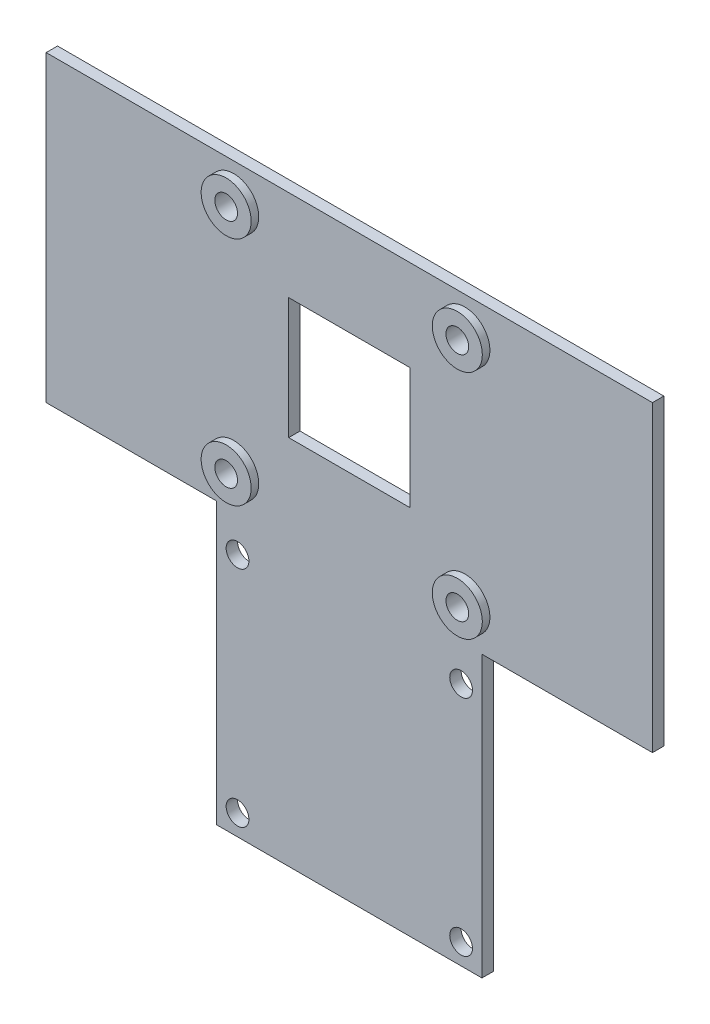
ISO-10303-21;
HEADER;
FILE_DESCRIPTION(('STEP AP214'),'2;1');
FILE_NAME('part.step','',(''),(''),'','','');
FILE_SCHEMA(('AUTOMOTIVE_DESIGN { 1 0 10303 214 1 1 1 1 }'));
ENDSEC;
DATA;
#1=APPLICATION_CONTEXT('core data for automotive mechanical design processes');
#2=APPLICATION_PROTOCOL_DEFINITION('international standard','automotive_design',2000,#1);
#3=PRODUCT_CONTEXT('',#1,'mechanical');
#4=PRODUCT('Part','Part','',(#3));
#5=PRODUCT_RELATED_PRODUCT_CATEGORY('part','',(#4));
#6=PRODUCT_DEFINITION_FORMATION('','',#4);
#7=PRODUCT_DEFINITION_CONTEXT('part definition',#1,'design');
#8=PRODUCT_DEFINITION('design','',#6,#7);
#9=PRODUCT_DEFINITION_SHAPE('','',#8);
#10=(LENGTH_UNIT() NAMED_UNIT(*) SI_UNIT(.MILLI.,.METRE.));
#11=(NAMED_UNIT(*) PLANE_ANGLE_UNIT() SI_UNIT($,.RADIAN.));
#12=(NAMED_UNIT(*) SI_UNIT($,.STERADIAN.) SOLID_ANGLE_UNIT());
#13=UNCERTAINTY_MEASURE_WITH_UNIT(LENGTH_MEASURE(1.E-05),#10,'distance_accuracy_value','');
#14=(GEOMETRIC_REPRESENTATION_CONTEXT(3) GLOBAL_UNCERTAINTY_ASSIGNED_CONTEXT((#13)) GLOBAL_UNIT_ASSIGNED_CONTEXT((#10,
#11,#12)) REPRESENTATION_CONTEXT('',''));
#15=CARTESIAN_POINT('',(0.,0.,0.));
#16=DIRECTION('',(0.,0.,1.));
#17=DIRECTION('',(1.,0.,0.));
#18=AXIS2_PLACEMENT_3D('',#15,#16,#17);
#19=CARTESIAN_POINT('',(0.,0.,1.5));
#20=DIRECTION('',(0.,0.,1.));
#21=DIRECTION('',(1.,0.,0.));
#22=AXIS2_PLACEMENT_3D('',#19,#20,#21);
#23=PLANE('',#22);
#24=CARTESIAN_POINT('',(-22.4791463831349,-14.9932103921682,1.5));
#25=DIRECTION('',(0.,0.,1.));
#26=DIRECTION('',(1.,0.,0.));
#27=AXIS2_PLACEMENT_3D('',#24,#25,#26);
#28=CIRCLE('',#27,3.3);
#29=CARTESIAN_POINT('',(-19.1791463831349,-14.9932103921682,1.5));
#30=VERTEX_POINT('',#29);
#31=EDGE_CURVE('E393',#30,#30,#28,.T.);
#32=ORIENTED_EDGE('',*,*,#31,.F.);
#33=EDGE_LOOP('',(#32));
#34=FACE_BOUND('',#33,.T.);
#35=CARTESIAN_POINT('',(-22.4791463831349,15.5067896078318,1.5));
#36=DIRECTION('',(0.,0.,1.));
#37=DIRECTION('',(1.,0.,0.));
#38=AXIS2_PLACEMENT_3D('',#35,#36,#37);
#39=CIRCLE('',#38,3.3);
#40=CARTESIAN_POINT('',(-19.1791463831349,15.5067896078318,1.5));
#41=VERTEX_POINT('',#40);
#42=EDGE_CURVE('E312',#41,#41,#39,.T.);
#43=ORIENTED_EDGE('',*,*,#42,.F.);
#44=EDGE_LOOP('',(#43));
#45=FACE_BOUND('',#44,.T.);
#46=CARTESIAN_POINT('',(-21.9791463831349,-53.9932103921682,1.5));
#47=DIRECTION('',(0.,0.,1.));
#48=DIRECTION('',(-1.,0.,0.));
#49=AXIS2_PLACEMENT_3D('',#46,#47,#48);
#50=CIRCLE('',#49,1.5);
#51=CARTESIAN_POINT('',(-23.4791463831349,-53.9932103921682,1.5));
#52=VERTEX_POINT('',#51);
#53=EDGE_CURVE('E334',#52,#52,#50,.T.);
#54=ORIENTED_EDGE('',*,*,#53,.F.);
#55=EDGE_LOOP('',(#54));
#56=FACE_BOUND('',#55,.T.);
#57=CARTESIAN_POINT('',(-21.9791463831349,-24.4932103921682,1.5));
#58=DIRECTION('',(0.,0.,1.));
#59=DIRECTION('',(-1.,0.,0.));
#60=AXIS2_PLACEMENT_3D('',#57,#58,#59);
#61=CIRCLE('',#60,1.5);
#62=CARTESIAN_POINT('',(-23.4791463831349,-24.4932103921682,1.5));
#63=VERTEX_POINT('',#62);
#64=EDGE_CURVE('E157',#63,#63,#61,.T.);
#65=ORIENTED_EDGE('',*,*,#64,.F.);
#66=EDGE_LOOP('',(#65));
#67=FACE_BOUND('',#66,.T.);
#68=DIRECTION('',(0.,-1.,0.));
#69=VECTOR('',#68,1.);
#70=CARTESIAN_POINT('',(-47.2291463831347,20.2567896078318,1.5));
#71=LINE('',#70,#69);
#72=CARTESIAN_POINT('',(-47.2291463831347,20.2567896078318,1.5));
#73=VERTEX_POINT('',#72);
#74=CARTESIAN_POINT('',(-47.2291463831347,-19.7432103921682,1.5));
#75=VERTEX_POINT('',#74);
#76=EDGE_CURVE('E179',#73,#75,#71,.T.);
#77=ORIENTED_EDGE('',*,*,#76,.T.);
#78=DIRECTION('',(1.,0.,0.));
#79=VECTOR('',#78,1.);
#80=CARTESIAN_POINT('',(-47.2291463831347,-19.7432103921682,1.5));
#81=LINE('',#80,#79);
#82=CARTESIAN_POINT('',(-24.7291463831349,-19.7432103921682,1.5));
#83=VERTEX_POINT('',#82);
#84=EDGE_CURVE('E182',#75,#83,#81,.T.);
#85=ORIENTED_EDGE('',*,*,#84,.T.);
#86=DIRECTION('',(0.,-1.,0.));
#87=VECTOR('',#86,1.);
#88=CARTESIAN_POINT('',(-24.7291463831349,-19.7432103921682,1.5));
#89=LINE('',#88,#87);
#90=CARTESIAN_POINT('',(-24.7291463831349,-56.7432103921682,1.5));
#91=VERTEX_POINT('',#90);
#92=EDGE_CURVE('E185',#83,#91,#89,.T.);
#93=ORIENTED_EDGE('',*,*,#92,.T.);
#94=DIRECTION('',(1.,0.,0.));
#95=VECTOR('',#94,1.);
#96=CARTESIAN_POINT('',(-24.7291463831349,-56.7432103921682,1.5));
#97=LINE('',#96,#95);
#98=CARTESIAN_POINT('',(10.2708536168651,-56.7432103921682,1.5));
#99=VERTEX_POINT('',#98);
#100=EDGE_CURVE('E187',#91,#99,#97,.T.);
#101=ORIENTED_EDGE('',*,*,#100,.T.);
#102=DIRECTION('',(0.,1.,0.));
#103=VECTOR('',#102,1.);
#104=CARTESIAN_POINT('',(10.2708536168651,-56.7432103921682,1.5));
#105=LINE('',#104,#103);
#106=CARTESIAN_POINT('',(10.2708536168651,-19.7432103921682,1.5));
#107=VERTEX_POINT('',#106);
#108=EDGE_CURVE('E189',#99,#107,#105,.T.);
#109=ORIENTED_EDGE('',*,*,#108,.T.);
#110=DIRECTION('',(1.,0.,0.));
#111=VECTOR('',#110,1.);
#112=CARTESIAN_POINT('',(10.2708536168651,-19.7432103921682,1.5));
#113=LINE('',#112,#111);
#114=CARTESIAN_POINT('',(32.7708536168649,-19.7432103921682,1.5));
#115=VERTEX_POINT('',#114);
#116=EDGE_CURVE('E191',#107,#115,#113,.T.);
#117=ORIENTED_EDGE('',*,*,#116,.T.);
#118=DIRECTION('',(0.,1.,0.));
#119=VECTOR('',#118,1.);
#120=CARTESIAN_POINT('',(32.7708536168649,20.2567896078318,1.5));
#121=LINE('',#120,#119);
#122=CARTESIAN_POINT('',(32.7708536168649,20.2567896078318,1.5));
#123=VERTEX_POINT('',#122);
#124=EDGE_CURVE('E193',#115,#123,#121,.T.);
#125=ORIENTED_EDGE('',*,*,#124,.T.);
#126=DIRECTION('',(-1.,0.,0.));
#127=VECTOR('',#126,1.);
#128=CARTESIAN_POINT('',(-47.2291463831347,20.2567896078318,1.5));
#129=LINE('',#128,#127);
#130=EDGE_CURVE('E195',#123,#73,#129,.T.);
#131=ORIENTED_EDGE('',*,*,#130,.T.);
#132=EDGE_LOOP('',(#77,#85,#93,#101,#109,#117,#125,#131));
#133=FACE_BOUND('',#132,.T.);
#134=DIRECTION('',(0.,1.,0.));
#135=VECTOR('',#134,1.);
#136=CARTESIAN_POINT('',(0.770853616865096,-7.74321039216817,1.5));
#137=LINE('',#136,#135);
#138=CARTESIAN_POINT('',(0.770853616865096,-7.74321039216817,1.5));
#139=VERTEX_POINT('',#138);
#140=CARTESIAN_POINT('',(0.770853616865096,8.25678960783183,1.5));
#141=VERTEX_POINT('',#140);
#142=EDGE_CURVE('E134',#139,#141,#137,.T.);
#143=ORIENTED_EDGE('',*,*,#142,.F.);
#144=DIRECTION('',(1.,0.,0.));
#145=VECTOR('',#144,1.);
#146=CARTESIAN_POINT('',(-15.2291463831349,-7.74321039216817,1.5));
#147=LINE('',#146,#145);
#148=CARTESIAN_POINT('',(-15.2291463831349,-7.74321039216817,1.5));
#149=VERTEX_POINT('',#148);
#150=EDGE_CURVE('E126',#149,#139,#147,.T.);
#151=ORIENTED_EDGE('',*,*,#150,.F.);
#152=DIRECTION('',(0.,-1.,0.));
#153=VECTOR('',#152,1.);
#154=CARTESIAN_POINT('',(-15.2291463831349,8.25678960783183,1.5));
#155=LINE('',#154,#153);
#156=CARTESIAN_POINT('',(-15.2291463831349,8.25678960783183,1.5));
#157=VERTEX_POINT('',#156);
#158=EDGE_CURVE('E150',#157,#149,#155,.T.);
#159=ORIENTED_EDGE('',*,*,#158,.F.);
#160=DIRECTION('',(-1.,0.,0.));
#161=VECTOR('',#160,1.);
#162=CARTESIAN_POINT('',(0.770853616865096,8.25678960783183,1.5));
#163=LINE('',#162,#161);
#164=EDGE_CURVE('E148',#141,#157,#163,.T.);
#165=ORIENTED_EDGE('',*,*,#164,.F.);
#166=EDGE_LOOP('',(#143,#151,#159,#165));
#167=FACE_BOUND('',#166,.T.);
#168=CARTESIAN_POINT('',(7.52085361686509,-24.4932103921682,1.5));
#169=DIRECTION('',(0.,0.,1.));
#170=DIRECTION('',(-1.,0.,0.));
#171=AXIS2_PLACEMENT_3D('',#168,#169,#170);
#172=CIRCLE('',#171,1.5);
#173=CARTESIAN_POINT('',(6.02085361686509,-24.4932103921682,1.5));
#174=VERTEX_POINT('',#173);
#175=EDGE_CURVE('E340',#174,#174,#172,.T.);
#176=ORIENTED_EDGE('',*,*,#175,.F.);
#177=EDGE_LOOP('',(#176));
#178=FACE_BOUND('',#177,.T.);
#179=CARTESIAN_POINT('',(7.52085361686509,-53.9932103921682,1.5));
#180=DIRECTION('',(0.,0.,1.));
#181=DIRECTION('',(-1.,0.,0.));
#182=AXIS2_PLACEMENT_3D('',#179,#180,#181);
#183=CIRCLE('',#182,1.5);
#184=CARTESIAN_POINT('',(6.02085361686509,-53.9932103921682,1.5));
#185=VERTEX_POINT('',#184);
#186=EDGE_CURVE('E328',#185,#185,#183,.T.);
#187=ORIENTED_EDGE('',*,*,#186,.F.);
#188=EDGE_LOOP('',(#187));
#189=FACE_BOUND('',#188,.T.);
#190=CARTESIAN_POINT('',(8.02085361686509,-14.9932103921682,1.5));
#191=DIRECTION('',(0.,0.,1.));
#192=DIRECTION('',(1.,0.,0.));
#193=AXIS2_PLACEMENT_3D('',#190,#191,#192);
#194=CIRCLE('',#193,3.3);
#195=CARTESIAN_POINT('',(11.3208536168651,-14.9932103921682,1.5));
#196=VERTEX_POINT('',#195);
#197=EDGE_CURVE('E390',#196,#196,#194,.T.);
#198=ORIENTED_EDGE('',*,*,#197,.F.);
#199=EDGE_LOOP('',(#198));
#200=FACE_BOUND('',#199,.T.);
#201=CARTESIAN_POINT('',(8.02085361686509,15.5067896078318,1.5));
#202=DIRECTION('',(0.,0.,1.));
#203=DIRECTION('',(1.,0.,0.));
#204=AXIS2_PLACEMENT_3D('',#201,#202,#203);
#205=CIRCLE('',#204,3.3);
#206=CARTESIAN_POINT('',(11.3208536168651,15.5067896078318,1.5));
#207=VERTEX_POINT('',#206);
#208=EDGE_CURVE('E319',#207,#207,#205,.T.);
#209=ORIENTED_EDGE('',*,*,#208,.F.);
#210=EDGE_LOOP('',(#209));
#211=FACE_BOUND('',#210,.T.);
#212=ADVANCED_FACE('F39',(#34,#45,#56,#67,#133,#167,#178,#189,#200,#211),#23,.T.);
#213=CARTESIAN_POINT('',(0.,0.,0.));
#214=DIRECTION('',(0.,0.,1.));
#215=DIRECTION('',(1.,0.,0.));
#216=AXIS2_PLACEMENT_3D('',#213,#214,#215);
#217=PLANE('',#216);
#218=CARTESIAN_POINT('',(-22.4791463831349,-14.9932103921682,0.));
#219=DIRECTION('',(0.,0.,1.));
#220=DIRECTION('',(-1.,0.,0.));
#221=AXIS2_PLACEMENT_3D('',#218,#219,#220);
#222=CIRCLE('',#221,1.5);
#223=CARTESIAN_POINT('',(-23.9791463831349,-14.9932103921682,0.));
#224=VERTEX_POINT('',#223);
#225=EDGE_CURVE('E143',#224,#224,#222,.T.);
#226=ORIENTED_EDGE('',*,*,#225,.T.);
#227=EDGE_LOOP('',(#226));
#228=FACE_BOUND('',#227,.T.);
#229=CARTESIAN_POINT('',(8.02085361686509,-14.9932103921682,0.));
#230=DIRECTION('',(0.,0.,1.));
#231=DIRECTION('',(1.,0.,0.));
#232=AXIS2_PLACEMENT_3D('',#229,#230,#231);
#233=CIRCLE('',#232,1.5);
#234=CARTESIAN_POINT('',(9.52085361686509,-14.9932103921682,0.));
#235=VERTEX_POINT('',#234);
#236=EDGE_CURVE('E169',#235,#235,#233,.T.);
#237=ORIENTED_EDGE('',*,*,#236,.T.);
#238=EDGE_LOOP('',(#237));
#239=FACE_BOUND('',#238,.T.);
#240=CARTESIAN_POINT('',(8.02085361686509,15.5067896078318,0.));
#241=DIRECTION('',(0.,0.,1.));
#242=DIRECTION('',(-1.,0.,0.));
#243=AXIS2_PLACEMENT_3D('',#240,#241,#242);
#244=CIRCLE('',#243,1.5);
#245=CARTESIAN_POINT('',(6.52085361686509,15.5067896078318,0.));
#246=VERTEX_POINT('',#245);
#247=EDGE_CURVE('E172',#246,#246,#244,.T.);
#248=ORIENTED_EDGE('',*,*,#247,.T.);
#249=EDGE_LOOP('',(#248));
#250=FACE_BOUND('',#249,.T.);
#251=CARTESIAN_POINT('',(-22.4791463831349,15.5067896078318,0.));
#252=DIRECTION('',(0.,0.,1.));
#253=DIRECTION('',(1.,0.,0.));
#254=AXIS2_PLACEMENT_3D('',#251,#252,#253);
#255=CIRCLE('',#254,1.5);
#256=CARTESIAN_POINT('',(-20.9791463831349,15.5067896078318,0.));
#257=VERTEX_POINT('',#256);
#258=EDGE_CURVE('E175',#257,#257,#255,.T.);
#259=ORIENTED_EDGE('',*,*,#258,.T.);
#260=EDGE_LOOP('',(#259));
#261=FACE_BOUND('',#260,.T.);
#262=DIRECTION('',(0.,-1.,0.));
#263=VECTOR('',#262,1.);
#264=CARTESIAN_POINT('',(-47.2291463831347,20.2567896078318,0.));
#265=LINE('',#264,#263);
#266=CARTESIAN_POINT('',(-47.2291463831347,20.2567896078318,0.));
#267=VERTEX_POINT('',#266);
#268=CARTESIAN_POINT('',(-47.2291463831347,-19.7432103921682,0.));
#269=VERTEX_POINT('',#268);
#270=EDGE_CURVE('E178',#267,#269,#265,.T.);
#271=ORIENTED_EDGE('',*,*,#270,.F.);
#272=DIRECTION('',(-1.,0.,0.));
#273=VECTOR('',#272,1.);
#274=CARTESIAN_POINT('',(-47.2291463831347,20.2567896078318,0.));
#275=LINE('',#274,#273);
#276=CARTESIAN_POINT('',(32.7708536168649,20.2567896078318,0.));
#277=VERTEX_POINT('',#276);
#278=EDGE_CURVE('E183',#277,#267,#275,.T.);
#279=ORIENTED_EDGE('',*,*,#278,.F.);
#280=DIRECTION('',(0.,1.,0.));
#281=VECTOR('',#280,1.);
#282=CARTESIAN_POINT('',(32.7708536168649,20.2567896078318,0.));
#283=LINE('',#282,#281);
#284=CARTESIAN_POINT('',(32.7708536168649,-19.7432103921682,0.));
#285=VERTEX_POINT('',#284);
#286=EDGE_CURVE('E210',#285,#277,#283,.T.);
#287=ORIENTED_EDGE('',*,*,#286,.F.);
#288=DIRECTION('',(1.,0.,0.));
#289=VECTOR('',#288,1.);
#290=CARTESIAN_POINT('',(10.2708536168651,-19.7432103921682,0.));
#291=LINE('',#290,#289);
#292=CARTESIAN_POINT('',(10.2708536168651,-19.7432103921682,0.));
#293=VERTEX_POINT('',#292);
#294=EDGE_CURVE('E208',#293,#285,#291,.T.);
#295=ORIENTED_EDGE('',*,*,#294,.F.);
#296=DIRECTION('',(0.,1.,0.));
#297=VECTOR('',#296,1.);
#298=CARTESIAN_POINT('',(10.2708536168651,-56.7432103921682,0.));
#299=LINE('',#298,#297);
#300=CARTESIAN_POINT('',(10.2708536168651,-56.7432103921682,0.));
#301=VERTEX_POINT('',#300);
#302=EDGE_CURVE('E206',#301,#293,#299,.T.);
#303=ORIENTED_EDGE('',*,*,#302,.F.);
#304=DIRECTION('',(1.,0.,0.));
#305=VECTOR('',#304,1.);
#306=CARTESIAN_POINT('',(-24.7291463831349,-56.7432103921682,0.));
#307=LINE('',#306,#305);
#308=CARTESIAN_POINT('',(-24.7291463831349,-56.7432103921682,0.));
#309=VERTEX_POINT('',#308);
#310=EDGE_CURVE('E204',#309,#301,#307,.T.);
#311=ORIENTED_EDGE('',*,*,#310,.F.);
#312=DIRECTION('',(0.,-1.,0.));
#313=VECTOR('',#312,1.);
#314=CARTESIAN_POINT('',(-24.7291463831349,-19.7432103921682,0.));
#315=LINE('',#314,#313);
#316=CARTESIAN_POINT('',(-24.7291463831349,-19.7432103921682,0.));
#317=VERTEX_POINT('',#316);
#318=EDGE_CURVE('E202',#317,#309,#315,.T.);
#319=ORIENTED_EDGE('',*,*,#318,.F.);
#320=DIRECTION('',(1.,0.,0.));
#321=VECTOR('',#320,1.);
#322=CARTESIAN_POINT('',(-47.2291463831347,-19.7432103921682,0.));
#323=LINE('',#322,#321);
#324=EDGE_CURVE('E200',#269,#317,#323,.T.);
#325=ORIENTED_EDGE('',*,*,#324,.F.);
#326=EDGE_LOOP('',(#271,#279,#287,#295,#303,#311,#319,#325));
#327=FACE_BOUND('',#326,.T.);
#328=DIRECTION('',(1.,0.,0.));
#329=VECTOR('',#328,1.);
#330=CARTESIAN_POINT('',(-7.2291463831349,-7.74321039216817,0.));
#331=LINE('',#330,#329);
#332=CARTESIAN_POINT('',(-15.2291463831349,-7.74321039216817,0.));
#333=VERTEX_POINT('',#332);
#334=CARTESIAN_POINT('',(0.770853616865096,-7.74321039216817,0.));
#335=VERTEX_POINT('',#334);
#336=EDGE_CURVE('E155',#333,#335,#331,.T.);
#337=ORIENTED_EDGE('',*,*,#336,.T.);
#338=DIRECTION('',(0.,1.,0.));
#339=VECTOR('',#338,1.);
#340=CARTESIAN_POINT('',(0.770853616865096,-7.74321039216817,0.));
#341=LINE('',#340,#339);
#342=CARTESIAN_POINT('',(0.770853616865096,8.25678960783183,0.));
#343=VERTEX_POINT('',#342);
#344=EDGE_CURVE('E141',#335,#343,#341,.T.);
#345=ORIENTED_EDGE('',*,*,#344,.T.);
#346=DIRECTION('',(-1.,0.,0.));
#347=VECTOR('',#346,1.);
#348=CARTESIAN_POINT('',(0.770853616865096,8.25678960783183,0.));
#349=LINE('',#348,#347);
#350=CARTESIAN_POINT('',(-15.2291463831349,8.25678960783183,0.));
#351=VERTEX_POINT('',#350);
#352=EDGE_CURVE('E159',#343,#351,#349,.T.);
#353=ORIENTED_EDGE('',*,*,#352,.T.);
#354=DIRECTION('',(0.,-1.,0.));
#355=VECTOR('',#354,1.);
#356=CARTESIAN_POINT('',(-15.2291463831349,8.25678960783183,0.));
#357=LINE('',#356,#355);
#358=EDGE_CURVE('E135',#351,#333,#357,.T.);
#359=ORIENTED_EDGE('',*,*,#358,.T.);
#360=EDGE_LOOP('',(#337,#345,#353,#359));
#361=FACE_BOUND('',#360,.T.);
#362=CARTESIAN_POINT('',(-21.9791463831349,-24.4932103921682,0.));
#363=DIRECTION('',(0.,0.,1.));
#364=DIRECTION('',(-1.,0.,0.));
#365=AXIS2_PLACEMENT_3D('',#362,#363,#364);
#366=CIRCLE('',#365,1.5);
#367=CARTESIAN_POINT('',(-23.4791463831349,-24.4932103921682,0.));
#368=VERTEX_POINT('',#367);
#369=EDGE_CURVE('E343',#368,#368,#366,.T.);
#370=ORIENTED_EDGE('',*,*,#369,.T.);
#371=EDGE_LOOP('',(#370));
#372=FACE_BOUND('',#371,.T.);
#373=CARTESIAN_POINT('',(7.52085361686509,-24.4932103921682,0.));
#374=DIRECTION('',(0.,0.,1.));
#375=DIRECTION('',(-1.,0.,0.));
#376=AXIS2_PLACEMENT_3D('',#373,#374,#375);
#377=CIRCLE('',#376,1.5);
#378=CARTESIAN_POINT('',(6.02085361686509,-24.4932103921682,0.));
#379=VERTEX_POINT('',#378);
#380=EDGE_CURVE('E337',#379,#379,#377,.T.);
#381=ORIENTED_EDGE('',*,*,#380,.T.);
#382=EDGE_LOOP('',(#381));
#383=FACE_BOUND('',#382,.T.);
#384=CARTESIAN_POINT('',(-21.9791463831349,-53.9932103921682,0.));
#385=DIRECTION('',(0.,0.,1.));
#386=DIRECTION('',(-1.,0.,0.));
#387=AXIS2_PLACEMENT_3D('',#384,#385,#386);
#388=CIRCLE('',#387,1.5);
#389=CARTESIAN_POINT('',(-23.4791463831349,-53.9932103921682,0.));
#390=VERTEX_POINT('',#389);
#391=EDGE_CURVE('E331',#390,#390,#388,.T.);
#392=ORIENTED_EDGE('',*,*,#391,.T.);
#393=EDGE_LOOP('',(#392));
#394=FACE_BOUND('',#393,.T.);
#395=CARTESIAN_POINT('',(7.52085361686509,-53.9932103921682,0.));
#396=DIRECTION('',(0.,0.,1.));
#397=DIRECTION('',(-1.,0.,0.));
#398=AXIS2_PLACEMENT_3D('',#395,#396,#397);
#399=CIRCLE('',#398,1.5);
#400=CARTESIAN_POINT('',(6.02085361686509,-53.9932103921682,0.));
#401=VERTEX_POINT('',#400);
#402=EDGE_CURVE('E326',#401,#401,#399,.T.);
#403=ORIENTED_EDGE('',*,*,#402,.T.);
#404=EDGE_LOOP('',(#403));
#405=FACE_BOUND('',#404,.T.);
#406=ADVANCED_FACE('F240',(#228,#239,#250,#261,#327,#361,#372,#383,#394,#405),#217,.F.);
#407=CARTESIAN_POINT('',(-47.2291463831347,20.2567896078318,1.5));
#408=DIRECTION('',(1.,0.,0.));
#409=DIRECTION('',(0.,1.,0.));
#410=AXIS2_PLACEMENT_3D('',#407,#408,#409);
#411=PLANE('',#410);
#412=ORIENTED_EDGE('',*,*,#270,.T.);
#413=DIRECTION('',(0.,0.,-1.));
#414=VECTOR('',#413,1.);
#415=CARTESIAN_POINT('',(-47.2291463831347,-19.7432103921682,1.5));
#416=LINE('',#415,#414);
#417=EDGE_CURVE('E11',#75,#269,#416,.T.);
#418=ORIENTED_EDGE('',*,*,#417,.F.);
#419=ORIENTED_EDGE('',*,*,#76,.F.);
#420=DIRECTION('',(0.,0.,-1.));
#421=VECTOR('',#420,1.);
#422=CARTESIAN_POINT('',(-47.2291463831347,20.2567896078318,1.5));
#423=LINE('',#422,#421);
#424=EDGE_CURVE('E197',#73,#267,#423,.T.);
#425=ORIENTED_EDGE('',*,*,#424,.T.);
#426=EDGE_LOOP('',(#412,#418,#419,#425));
#427=FACE_BOUND('',#426,.T.);
#428=ADVANCED_FACE('F41',(#427),#411,.F.);
#429=CARTESIAN_POINT('',(-47.2291463831347,-19.7432103921682,1.5));
#430=DIRECTION('',(0.,1.,0.));
#431=DIRECTION('',(0.,0.,1.));
#432=AXIS2_PLACEMENT_3D('',#429,#430,#431);
#433=PLANE('',#432);
#434=ORIENTED_EDGE('',*,*,#324,.T.);
#435=DIRECTION('',(0.,0.,-1.));
#436=VECTOR('',#435,1.);
#437=CARTESIAN_POINT('',(-24.7291463831349,-19.7432103921682,1.5));
#438=LINE('',#437,#436);
#439=EDGE_CURVE('E47',#83,#317,#438,.T.);
#440=ORIENTED_EDGE('',*,*,#439,.F.);
#441=ORIENTED_EDGE('',*,*,#84,.F.);
#442=ORIENTED_EDGE('',*,*,#417,.T.);
#443=EDGE_LOOP('',(#434,#440,#441,#442));
#444=FACE_BOUND('',#443,.T.);
#445=ADVANCED_FACE('F257',(#444),#433,.F.);
#446=CARTESIAN_POINT('',(-24.7291463831349,-19.7432103921682,1.5));
#447=DIRECTION('',(1.,0.,0.));
#448=DIRECTION('',(0.,1.,0.));
#449=AXIS2_PLACEMENT_3D('',#446,#447,#448);
#450=PLANE('',#449);
#451=ORIENTED_EDGE('',*,*,#318,.T.);
#452=DIRECTION('',(0.,0.,-1.));
#453=VECTOR('',#452,1.);
#454=CARTESIAN_POINT('',(-24.7291463831349,-56.7432103921682,1.5));
#455=LINE('',#454,#453);
#456=EDGE_CURVE('E227',#91,#309,#455,.T.);
#457=ORIENTED_EDGE('',*,*,#456,.F.);
#458=ORIENTED_EDGE('',*,*,#92,.F.);
#459=ORIENTED_EDGE('',*,*,#439,.T.);
#460=EDGE_LOOP('',(#451,#457,#458,#459));
#461=FACE_BOUND('',#460,.T.);
#462=ADVANCED_FACE('F234',(#461),#450,.F.);
#463=CARTESIAN_POINT('',(-24.7291463831349,-56.7432103921682,1.5));
#464=DIRECTION('',(0.,1.,0.));
#465=DIRECTION('',(0.,0.,1.));
#466=AXIS2_PLACEMENT_3D('',#463,#464,#465);
#467=PLANE('',#466);
#468=ORIENTED_EDGE('',*,*,#310,.T.);
#469=DIRECTION('',(0.,0.,-1.));
#470=VECTOR('',#469,1.);
#471=CARTESIAN_POINT('',(10.2708536168651,-56.7432103921682,1.5));
#472=LINE('',#471,#470);
#473=EDGE_CURVE('E224',#99,#301,#472,.T.);
#474=ORIENTED_EDGE('',*,*,#473,.F.);
#475=ORIENTED_EDGE('',*,*,#100,.F.);
#476=ORIENTED_EDGE('',*,*,#456,.T.);
#477=EDGE_LOOP('',(#468,#474,#475,#476));
#478=FACE_BOUND('',#477,.T.);
#479=ADVANCED_FACE('F246',(#478),#467,.F.);
#480=CARTESIAN_POINT('',(10.2708536168651,-56.7432103921682,1.5));
#481=DIRECTION('',(-1.,0.,0.));
#482=DIRECTION('',(0.,-1.,0.));
#483=AXIS2_PLACEMENT_3D('',#480,#481,#482);
#484=PLANE('',#483);
#485=ORIENTED_EDGE('',*,*,#302,.T.);
#486=DIRECTION('',(0.,0.,-1.));
#487=VECTOR('',#486,1.);
#488=CARTESIAN_POINT('',(10.2708536168651,-19.7432103921682,1.5));
#489=LINE('',#488,#487);
#490=EDGE_CURVE('E221',#107,#293,#489,.T.);
#491=ORIENTED_EDGE('',*,*,#490,.F.);
#492=ORIENTED_EDGE('',*,*,#108,.F.);
#493=ORIENTED_EDGE('',*,*,#473,.T.);
#494=EDGE_LOOP('',(#485,#491,#492,#493));
#495=FACE_BOUND('',#494,.T.);
#496=ADVANCED_FACE('F250',(#495),#484,.F.);
#497=CARTESIAN_POINT('',(10.2708536168651,-19.7432103921682,1.5));
#498=DIRECTION('',(0.,1.,0.));
#499=DIRECTION('',(-1.,0.,0.));
#500=AXIS2_PLACEMENT_3D('',#497,#498,#499);
#501=PLANE('',#500);
#502=ORIENTED_EDGE('',*,*,#294,.T.);
#503=DIRECTION('',(0.,0.,-1.));
#504=VECTOR('',#503,1.);
#505=CARTESIAN_POINT('',(32.7708536168649,-19.7432103921682,1.5));
#506=LINE('',#505,#504);
#507=EDGE_CURVE('E218',#115,#285,#506,.T.);
#508=ORIENTED_EDGE('',*,*,#507,.F.);
#509=ORIENTED_EDGE('',*,*,#116,.F.);
#510=ORIENTED_EDGE('',*,*,#490,.T.);
#511=EDGE_LOOP('',(#502,#508,#509,#510));
#512=FACE_BOUND('',#511,.T.);
#513=ADVANCED_FACE('F270',(#512),#501,.F.);
#514=CARTESIAN_POINT('',(32.7708536168649,20.2567896078318,1.5));
#515=DIRECTION('',(-1.,0.,0.));
#516=DIRECTION('',(0.,0.,1.));
#517=AXIS2_PLACEMENT_3D('',#514,#515,#516);
#518=PLANE('',#517);
#519=ORIENTED_EDGE('',*,*,#286,.T.);
#520=DIRECTION('',(0.,0.,-1.));
#521=VECTOR('',#520,1.);
#522=CARTESIAN_POINT('',(32.7708536168649,20.2567896078318,1.5));
#523=LINE('',#522,#521);
#524=EDGE_CURVE('E215',#123,#277,#523,.T.);
#525=ORIENTED_EDGE('',*,*,#524,.F.);
#526=ORIENTED_EDGE('',*,*,#124,.F.);
#527=ORIENTED_EDGE('',*,*,#507,.T.);
#528=EDGE_LOOP('',(#519,#525,#526,#527));
#529=FACE_BOUND('',#528,.T.);
#530=ADVANCED_FACE('F268',(#529),#518,.F.);
#531=CARTESIAN_POINT('',(-47.2291463831347,20.2567896078318,1.5));
#532=DIRECTION('',(0.,-1.,0.));
#533=DIRECTION('',(1.,0.,0.));
#534=AXIS2_PLACEMENT_3D('',#531,#532,#533);
#535=PLANE('',#534);
#536=ORIENTED_EDGE('',*,*,#278,.T.);
#537=ORIENTED_EDGE('',*,*,#424,.F.);
#538=ORIENTED_EDGE('',*,*,#130,.F.);
#539=ORIENTED_EDGE('',*,*,#524,.T.);
#540=EDGE_LOOP('',(#536,#537,#538,#539));
#541=FACE_BOUND('',#540,.T.);
#542=ADVANCED_FACE('F263',(#541),#535,.F.);
#543=CARTESIAN_POINT('',(-22.4791463831349,15.5067896078318,1.5));
#544=DIRECTION('',(0.,0.,-1.));
#545=DIRECTION('',(-1.,0.,0.));
#546=AXIS2_PLACEMENT_3D('',#543,#544,#545);
#547=CYLINDRICAL_SURFACE('',#546,1.5);
#548=ORIENTED_EDGE('',*,*,#258,.F.);
#549=EDGE_LOOP('',(#548));
#550=FACE_BOUND('',#549,.T.);
#551=CARTESIAN_POINT('',(-22.4791463831349,15.5067896078318,2.5));
#552=DIRECTION('',(0.,0.,1.));
#553=DIRECTION('',(1.,0.,0.));
#554=AXIS2_PLACEMENT_3D('',#551,#552,#553);
#555=CIRCLE('',#554,1.5);
#556=CARTESIAN_POINT('',(-20.9791463831349,15.5067896078318,2.5));
#557=VERTEX_POINT('',#556);
#558=EDGE_CURVE('E310',#557,#557,#555,.T.);
#559=ORIENTED_EDGE('',*,*,#558,.T.);
#560=EDGE_LOOP('',(#559));
#561=FACE_BOUND('',#560,.T.);
#562=ADVANCED_FACE('F292',(#550,#561),#547,.F.);
#563=CARTESIAN_POINT('',(8.02085361686509,15.5067896078318,1.5));
#564=DIRECTION('',(0.,0.,-1.));
#565=DIRECTION('',(-1.,0.,0.));
#566=AXIS2_PLACEMENT_3D('',#563,#564,#565);
#567=CYLINDRICAL_SURFACE('',#566,1.5);
#568=ORIENTED_EDGE('',*,*,#247,.F.);
#569=EDGE_LOOP('',(#568));
#570=FACE_BOUND('',#569,.T.);
#571=CARTESIAN_POINT('',(8.02085361686509,15.5067896078318,2.5));
#572=DIRECTION('',(0.,0.,1.));
#573=DIRECTION('',(1.,0.,0.));
#574=AXIS2_PLACEMENT_3D('',#571,#572,#573);
#575=CIRCLE('',#574,1.5);
#576=CARTESIAN_POINT('',(9.52085361686509,15.5067896078318,2.5));
#577=VERTEX_POINT('',#576);
#578=EDGE_CURVE('E313',#577,#577,#575,.T.);
#579=ORIENTED_EDGE('',*,*,#578,.T.);
#580=EDGE_LOOP('',(#579));
#581=FACE_BOUND('',#580,.T.);
#582=ADVANCED_FACE('F299',(#570,#581),#567,.F.);
#583=CARTESIAN_POINT('',(8.02085361686509,-14.9932103921682,1.5));
#584=DIRECTION('',(0.,0.,-1.));
#585=DIRECTION('',(-1.,0.,0.));
#586=AXIS2_PLACEMENT_3D('',#583,#584,#585);
#587=CYLINDRICAL_SURFACE('',#586,1.5);
#588=ORIENTED_EDGE('',*,*,#236,.F.);
#589=EDGE_LOOP('',(#588));
#590=FACE_BOUND('',#589,.T.);
#591=CARTESIAN_POINT('',(8.02085361686509,-14.9932103921682,2.5));
#592=DIRECTION('',(0.,0.,1.));
#593=DIRECTION('',(1.,0.,0.));
#594=AXIS2_PLACEMENT_3D('',#591,#592,#593);
#595=CIRCLE('',#594,1.5);
#596=CARTESIAN_POINT('',(9.52085361686509,-14.9932103921682,2.5));
#597=VERTEX_POINT('',#596);
#598=EDGE_CURVE('E387',#597,#597,#595,.T.);
#599=ORIENTED_EDGE('',*,*,#598,.T.);
#600=EDGE_LOOP('',(#599));
#601=FACE_BOUND('',#600,.T.);
#602=ADVANCED_FACE('F304',(#590,#601),#587,.F.);
#603=CARTESIAN_POINT('',(-22.4791463831349,-14.9932103921682,1.5));
#604=DIRECTION('',(0.,0.,-1.));
#605=DIRECTION('',(-1.,0.,0.));
#606=AXIS2_PLACEMENT_3D('',#603,#604,#605);
#607=CYLINDRICAL_SURFACE('',#606,1.5);
#608=ORIENTED_EDGE('',*,*,#225,.F.);
#609=EDGE_LOOP('',(#608));
#610=FACE_BOUND('',#609,.T.);
#611=CARTESIAN_POINT('',(-22.4791463831349,-14.9932103921682,2.5));
#612=DIRECTION('',(0.,0.,1.));
#613=DIRECTION('',(1.,0.,0.));
#614=AXIS2_PLACEMENT_3D('',#611,#612,#613);
#615=CIRCLE('',#614,1.5);
#616=CARTESIAN_POINT('',(-20.9791463831349,-14.9932103921682,2.5));
#617=VERTEX_POINT('',#616);
#618=EDGE_CURVE('E323',#617,#617,#615,.T.);
#619=ORIENTED_EDGE('',*,*,#618,.T.);
#620=EDGE_LOOP('',(#619));
#621=FACE_BOUND('',#620,.T.);
#622=ADVANCED_FACE('F375',(#610,#621),#607,.F.);
#623=CARTESIAN_POINT('',(-7.2291463831349,-7.74321039216817,1.5));
#624=DIRECTION('',(0.,1.,0.));
#625=DIRECTION('',(0.,0.,1.));
#626=AXIS2_PLACEMENT_3D('',#623,#624,#625);
#627=PLANE('',#626);
#628=ORIENTED_EDGE('',*,*,#336,.F.);
#629=DIRECTION('',(0.,0.,-1.));
#630=VECTOR('',#629,1.);
#631=CARTESIAN_POINT('',(-15.2291463831349,-7.74321039216817,1.5));
#632=LINE('',#631,#630);
#633=EDGE_CURVE('E59',#149,#333,#632,.T.);
#634=ORIENTED_EDGE('',*,*,#633,.F.);
#635=ORIENTED_EDGE('',*,*,#150,.T.);
#636=DIRECTION('',(0.,0.,-1.));
#637=VECTOR('',#636,1.);
#638=CARTESIAN_POINT('',(0.770853616865096,-7.74321039216817,1.5));
#639=LINE('',#638,#637);
#640=EDGE_CURVE('E129',#139,#335,#639,.T.);
#641=ORIENTED_EDGE('',*,*,#640,.T.);
#642=EDGE_LOOP('',(#628,#634,#635,#641));
#643=FACE_BOUND('',#642,.T.);
#644=ADVANCED_FACE('F128',(#643),#627,.T.);
#645=CARTESIAN_POINT('',(0.770853616865096,-7.74321039216817,1.5));
#646=DIRECTION('',(-1.,0.,0.));
#647=DIRECTION('',(0.,0.,1.));
#648=AXIS2_PLACEMENT_3D('',#645,#646,#647);
#649=PLANE('',#648);
#650=ORIENTED_EDGE('',*,*,#344,.F.);
#651=ORIENTED_EDGE('',*,*,#640,.F.);
#652=ORIENTED_EDGE('',*,*,#142,.T.);
#653=DIRECTION('',(0.,0.,-1.));
#654=VECTOR('',#653,1.);
#655=CARTESIAN_POINT('',(0.770853616865096,8.25678960783183,1.5));
#656=LINE('',#655,#654);
#657=EDGE_CURVE('E144',#141,#343,#656,.T.);
#658=ORIENTED_EDGE('',*,*,#657,.T.);
#659=EDGE_LOOP('',(#650,#651,#652,#658));
#660=FACE_BOUND('',#659,.T.);
#661=ADVANCED_FACE('F138',(#660),#649,.T.);
#662=CARTESIAN_POINT('',(0.770853616865096,8.25678960783183,1.5));
#663=DIRECTION('',(0.,-1.,0.));
#664=DIRECTION('',(1.,0.,0.));
#665=AXIS2_PLACEMENT_3D('',#662,#663,#664);
#666=PLANE('',#665);
#667=ORIENTED_EDGE('',*,*,#352,.F.);
#668=ORIENTED_EDGE('',*,*,#657,.F.);
#669=ORIENTED_EDGE('',*,*,#164,.T.);
#670=DIRECTION('',(0.,0.,-1.));
#671=VECTOR('',#670,1.);
#672=CARTESIAN_POINT('',(-15.2291463831349,8.25678960783183,1.5));
#673=LINE('',#672,#671);
#674=EDGE_CURVE('E54',#157,#351,#673,.T.);
#675=ORIENTED_EDGE('',*,*,#674,.T.);
#676=EDGE_LOOP('',(#667,#668,#669,#675));
#677=FACE_BOUND('',#676,.T.);
#678=ADVANCED_FACE('F365',(#677),#666,.T.);
#679=CARTESIAN_POINT('',(-15.2291463831349,8.25678960783183,1.5));
#680=DIRECTION('',(1.,0.,0.));
#681=DIRECTION('',(0.,0.,-1.));
#682=AXIS2_PLACEMENT_3D('',#679,#680,#681);
#683=PLANE('',#682);
#684=ORIENTED_EDGE('',*,*,#358,.F.);
#685=ORIENTED_EDGE('',*,*,#674,.F.);
#686=ORIENTED_EDGE('',*,*,#158,.T.);
#687=ORIENTED_EDGE('',*,*,#633,.T.);
#688=EDGE_LOOP('',(#684,#685,#686,#687));
#689=FACE_BOUND('',#688,.T.);
#690=ADVANCED_FACE('F355',(#689),#683,.T.);
#691=CARTESIAN_POINT('',(-21.9791463831349,-24.4932103921682,1.5));
#692=DIRECTION('',(0.,0.,-1.));
#693=DIRECTION('',(-1.,0.,0.));
#694=AXIS2_PLACEMENT_3D('',#691,#692,#693);
#695=CYLINDRICAL_SURFACE('',#694,1.5);
#696=ORIENTED_EDGE('',*,*,#64,.T.);
#697=EDGE_LOOP('',(#696));
#698=FACE_BOUND('',#697,.T.);
#699=ORIENTED_EDGE('',*,*,#369,.F.);
#700=EDGE_LOOP('',(#699));
#701=FACE_BOUND('',#700,.T.);
#702=ADVANCED_FACE('F352',(#698,#701),#695,.F.);
#703=CARTESIAN_POINT('',(7.52085361686509,-24.4932103921682,1.5));
#704=DIRECTION('',(0.,0.,-1.));
#705=DIRECTION('',(-1.,0.,0.));
#706=AXIS2_PLACEMENT_3D('',#703,#704,#705);
#707=CYLINDRICAL_SURFACE('',#706,1.5);
#708=ORIENTED_EDGE('',*,*,#175,.T.);
#709=EDGE_LOOP('',(#708));
#710=FACE_BOUND('',#709,.T.);
#711=ORIENTED_EDGE('',*,*,#380,.F.);
#712=EDGE_LOOP('',(#711));
#713=FACE_BOUND('',#712,.T.);
#714=ADVANCED_FACE('F354',(#710,#713),#707,.F.);
#715=CARTESIAN_POINT('',(-21.9791463831349,-53.9932103921682,1.5));
#716=DIRECTION('',(0.,0.,-1.));
#717=DIRECTION('',(-1.,0.,0.));
#718=AXIS2_PLACEMENT_3D('',#715,#716,#717);
#719=CYLINDRICAL_SURFACE('',#718,1.5);
#720=ORIENTED_EDGE('',*,*,#53,.T.);
#721=EDGE_LOOP('',(#720));
#722=FACE_BOUND('',#721,.T.);
#723=ORIENTED_EDGE('',*,*,#391,.F.);
#724=EDGE_LOOP('',(#723));
#725=FACE_BOUND('',#724,.T.);
#726=ADVANCED_FACE('F362',(#722,#725),#719,.F.);
#727=CARTESIAN_POINT('',(7.52085361686509,-53.9932103921682,1.5));
#728=DIRECTION('',(0.,0.,-1.));
#729=DIRECTION('',(-1.,0.,0.));
#730=AXIS2_PLACEMENT_3D('',#727,#728,#729);
#731=CYLINDRICAL_SURFACE('',#730,1.5);
#732=ORIENTED_EDGE('',*,*,#186,.T.);
#733=EDGE_LOOP('',(#732));
#734=FACE_BOUND('',#733,.T.);
#735=ORIENTED_EDGE('',*,*,#402,.F.);
#736=EDGE_LOOP('',(#735));
#737=FACE_BOUND('',#736,.T.);
#738=ADVANCED_FACE('F413',(#734,#737),#731,.F.);
#739=CARTESIAN_POINT('',(-22.4791463831349,-14.9932103921682,2.5));
#740=DIRECTION('',(0.,0.,1.));
#741=DIRECTION('',(1.,0.,0.));
#742=AXIS2_PLACEMENT_3D('',#739,#740,#741);
#743=PLANE('',#742);
#744=CARTESIAN_POINT('',(-22.4791463831349,-14.9932103921682,2.5));
#745=DIRECTION('',(0.,0.,1.));
#746=DIRECTION('',(1.,0.,0.));
#747=AXIS2_PLACEMENT_3D('',#744,#745,#746);
#748=CIRCLE('',#747,3.3);
#749=CARTESIAN_POINT('',(-19.1791463831349,-14.9932103921682,2.5));
#750=VERTEX_POINT('',#749);
#751=EDGE_CURVE('E389',#750,#750,#748,.T.);
#752=ORIENTED_EDGE('',*,*,#751,.T.);
#753=EDGE_LOOP('',(#752));
#754=FACE_BOUND('',#753,.T.);
#755=ORIENTED_EDGE('',*,*,#618,.F.);
#756=EDGE_LOOP('',(#755));
#757=FACE_BOUND('',#756,.T.);
#758=ADVANCED_FACE('F410',(#754,#757),#743,.T.);
#759=CARTESIAN_POINT('',(-22.4791463831349,-14.9932103921682,2.5));
#760=DIRECTION('',(0.,0.,-1.));
#761=DIRECTION('',(-1.,0.,0.));
#762=AXIS2_PLACEMENT_3D('',#759,#760,#761);
#763=CYLINDRICAL_SURFACE('',#762,3.3);
#764=ORIENTED_EDGE('',*,*,#751,.F.);
#765=EDGE_LOOP('',(#764));
#766=FACE_BOUND('',#765,.T.);
#767=ORIENTED_EDGE('',*,*,#31,.T.);
#768=EDGE_LOOP('',(#767));
#769=FACE_BOUND('',#768,.T.);
#770=ADVANCED_FACE('F412',(#766,#769),#763,.T.);
#771=CARTESIAN_POINT('',(8.02085361686509,-14.9932103921682,2.5));
#772=DIRECTION('',(0.,0.,1.));
#773=DIRECTION('',(1.,0.,0.));
#774=AXIS2_PLACEMENT_3D('',#771,#772,#773);
#775=PLANE('',#774);
#776=CARTESIAN_POINT('',(8.02085361686509,-14.9932103921682,2.5));
#777=DIRECTION('',(0.,0.,1.));
#778=DIRECTION('',(1.,0.,0.));
#779=AXIS2_PLACEMENT_3D('',#776,#777,#778);
#780=CIRCLE('',#779,3.3);
#781=CARTESIAN_POINT('',(11.3208536168651,-14.9932103921682,2.5));
#782=VERTEX_POINT('',#781);
#783=EDGE_CURVE('E395',#782,#782,#780,.T.);
#784=ORIENTED_EDGE('',*,*,#783,.T.);
#785=EDGE_LOOP('',(#784));
#786=FACE_BOUND('',#785,.T.);
#787=ORIENTED_EDGE('',*,*,#598,.F.);
#788=EDGE_LOOP('',(#787));
#789=FACE_BOUND('',#788,.T.);
#790=ADVANCED_FACE('F419',(#786,#789),#775,.T.);
#791=CARTESIAN_POINT('',(8.02085361686509,-14.9932103921682,2.5));
#792=DIRECTION('',(0.,0.,-1.));
#793=DIRECTION('',(-1.,0.,0.));
#794=AXIS2_PLACEMENT_3D('',#791,#792,#793);
#795=CYLINDRICAL_SURFACE('',#794,3.3);
#796=ORIENTED_EDGE('',*,*,#783,.F.);
#797=EDGE_LOOP('',(#796));
#798=FACE_BOUND('',#797,.T.);
#799=ORIENTED_EDGE('',*,*,#197,.T.);
#800=EDGE_LOOP('',(#799));
#801=FACE_BOUND('',#800,.T.);
#802=ADVANCED_FACE('F508',(#798,#801),#795,.T.);
#803=CARTESIAN_POINT('',(8.02085361686509,15.5067896078318,2.5));
#804=DIRECTION('',(0.,0.,1.));
#805=DIRECTION('',(1.,0.,0.));
#806=AXIS2_PLACEMENT_3D('',#803,#804,#805);
#807=PLANE('',#806);
#808=CARTESIAN_POINT('',(8.02085361686509,15.5067896078318,2.5));
#809=DIRECTION('',(0.,0.,1.));
#810=DIRECTION('',(1.,0.,0.));
#811=AXIS2_PLACEMENT_3D('',#808,#809,#810);
#812=CIRCLE('',#811,3.3);
#813=CARTESIAN_POINT('',(11.3208536168651,15.5067896078318,2.5));
#814=VERTEX_POINT('',#813);
#815=EDGE_CURVE('E401',#814,#814,#812,.T.);
#816=ORIENTED_EDGE('',*,*,#815,.T.);
#817=EDGE_LOOP('',(#816));
#818=FACE_BOUND('',#817,.T.);
#819=ORIENTED_EDGE('',*,*,#578,.F.);
#820=EDGE_LOOP('',(#819));
#821=FACE_BOUND('',#820,.T.);
#822=ADVANCED_FACE('F518',(#818,#821),#807,.T.);
#823=CARTESIAN_POINT('',(8.02085361686509,15.5067896078318,2.5));
#824=DIRECTION('',(0.,0.,-1.));
#825=DIRECTION('',(-1.,0.,0.));
#826=AXIS2_PLACEMENT_3D('',#823,#824,#825);
#827=CYLINDRICAL_SURFACE('',#826,3.3);
#828=ORIENTED_EDGE('',*,*,#815,.F.);
#829=EDGE_LOOP('',(#828));
#830=FACE_BOUND('',#829,.T.);
#831=ORIENTED_EDGE('',*,*,#208,.T.);
#832=EDGE_LOOP('',(#831));
#833=FACE_BOUND('',#832,.T.);
#834=ADVANCED_FACE('F430',(#830,#833),#827,.T.);
#835=CARTESIAN_POINT('',(-22.4791463831349,15.5067896078318,2.5));
#836=DIRECTION('',(0.,0.,1.));
#837=DIRECTION('',(1.,0.,0.));
#838=AXIS2_PLACEMENT_3D('',#835,#836,#837);
#839=PLANE('',#838);
#840=CARTESIAN_POINT('',(-22.4791463831349,15.5067896078318,2.5));
#841=DIRECTION('',(0.,0.,1.));
#842=DIRECTION('',(1.,0.,0.));
#843=AXIS2_PLACEMENT_3D('',#840,#841,#842);
#844=CIRCLE('',#843,3.3);
#845=CARTESIAN_POINT('',(-19.1791463831349,15.5067896078318,2.5));
#846=VERTEX_POINT('',#845);
#847=EDGE_CURVE('E316',#846,#846,#844,.T.);
#848=ORIENTED_EDGE('',*,*,#847,.T.);
#849=EDGE_LOOP('',(#848));
#850=FACE_BOUND('',#849,.T.);
#851=ORIENTED_EDGE('',*,*,#558,.F.);
#852=EDGE_LOOP('',(#851));
#853=FACE_BOUND('',#852,.T.);
#854=ADVANCED_FACE('F426',(#850,#853),#839,.T.);
#855=CARTESIAN_POINT('',(-22.4791463831349,15.5067896078318,2.5));
#856=DIRECTION('',(0.,0.,-1.));
#857=DIRECTION('',(-1.,0.,0.));
#858=AXIS2_PLACEMENT_3D('',#855,#856,#857);
#859=CYLINDRICAL_SURFACE('',#858,3.3);
#860=ORIENTED_EDGE('',*,*,#847,.F.);
#861=EDGE_LOOP('',(#860));
#862=FACE_BOUND('',#861,.T.);
#863=ORIENTED_EDGE('',*,*,#42,.T.);
#864=EDGE_LOOP('',(#863));
#865=FACE_BOUND('',#864,.T.);
#866=ADVANCED_FACE('F429',(#862,#865),#859,.T.);
#867=CLOSED_SHELL('',(#212,#406,#428,#445,#462,#479,#496,#513,#530,#542,#562,#582,#602,#622,
#644,#661,#678,#690,#702,#714,#726,#738,#758,#770,#790,#802,#822,#834,#854,#866));
#868=MANIFOLD_SOLID_BREP('B2',#867);
#869=ADVANCED_BREP_SHAPE_REPRESENTATION('',(#18,#868),#14);
#870=SHAPE_DEFINITION_REPRESENTATION(#9,#869);
ENDSEC;
END-ISO-10303-21;
